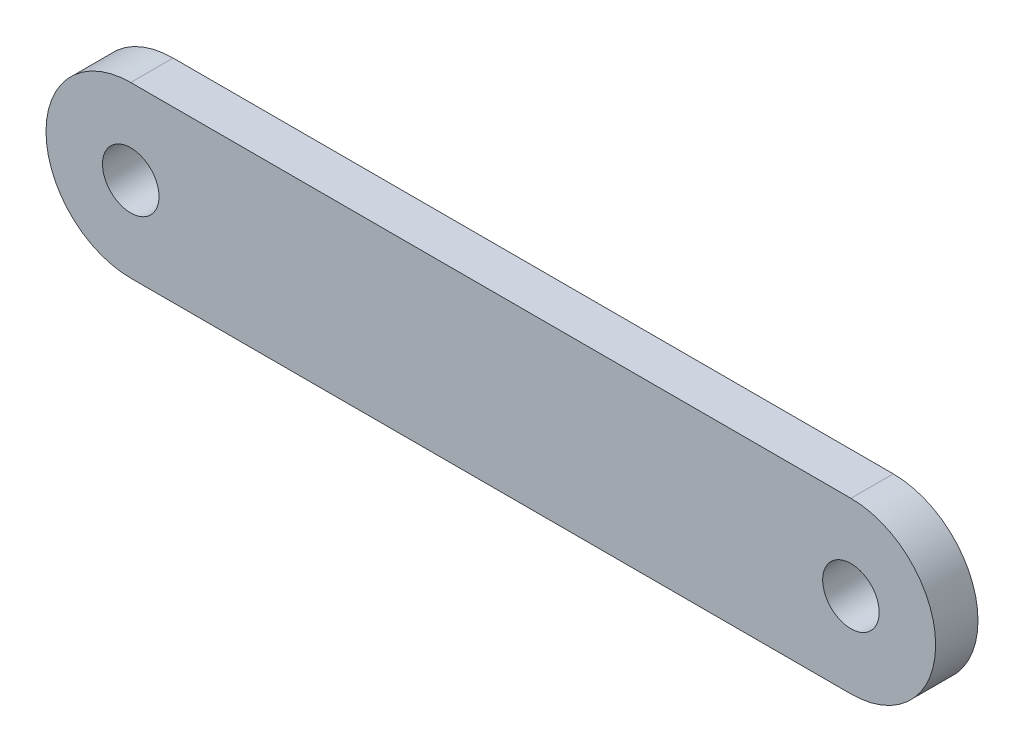
ISO-10303-21;
HEADER;
FILE_DESCRIPTION(('STEP AP214'),'2;1');
FILE_NAME('part.step','',(''),(''),'','','');
FILE_SCHEMA(('AUTOMOTIVE_DESIGN { 1 0 10303 214 1 1 1 1 }'));
ENDSEC;
DATA;
#1=APPLICATION_CONTEXT('core data for automotive mechanical design processes');
#2=APPLICATION_PROTOCOL_DEFINITION('international standard','automotive_design',2000,#1);
#3=PRODUCT_CONTEXT('',#1,'mechanical');
#4=PRODUCT('Part','Part','',(#3));
#5=PRODUCT_RELATED_PRODUCT_CATEGORY('part','',(#4));
#6=PRODUCT_DEFINITION_FORMATION('','',#4);
#7=PRODUCT_DEFINITION_CONTEXT('part definition',#1,'design');
#8=PRODUCT_DEFINITION('design','',#6,#7);
#9=PRODUCT_DEFINITION_SHAPE('','',#8);
#10=(LENGTH_UNIT() NAMED_UNIT(*) SI_UNIT(.MILLI.,.METRE.));
#11=(NAMED_UNIT(*) PLANE_ANGLE_UNIT() SI_UNIT($,.RADIAN.));
#12=(NAMED_UNIT(*) SI_UNIT($,.STERADIAN.) SOLID_ANGLE_UNIT());
#13=UNCERTAINTY_MEASURE_WITH_UNIT(LENGTH_MEASURE(1.E-05),#10,'distance_accuracy_value','');
#14=(GEOMETRIC_REPRESENTATION_CONTEXT(3) GLOBAL_UNCERTAINTY_ASSIGNED_CONTEXT((#13)) GLOBAL_UNIT_ASSIGNED_CONTEXT((#10,
#11,#12)) REPRESENTATION_CONTEXT('',''));
#15=CARTESIAN_POINT('',(0.,0.,0.));
#16=DIRECTION('',(0.,0.,1.));
#17=DIRECTION('',(1.,0.,0.));
#18=AXIS2_PLACEMENT_3D('',#15,#16,#17);
#19=CARTESIAN_POINT('',(-25.5,0.,-1.5));
#20=DIRECTION('',(0.,0.,1.));
#21=DIRECTION('',(1.,0.,0.));
#22=AXIS2_PLACEMENT_3D('',#19,#20,#21);
#23=CYLINDRICAL_SURFACE('',#22,3.);
#24=CARTESIAN_POINT('',(-25.5,0.,0.));
#25=DIRECTION('',(0.,0.,1.));
#26=DIRECTION('',(-1.,0.,0.));
#27=AXIS2_PLACEMENT_3D('',#24,#25,#26);
#28=CIRCLE('',#27,3.);
#29=CARTESIAN_POINT('',(-25.5,3.,0.));
#30=VERTEX_POINT('',#29);
#31=CARTESIAN_POINT('',(-25.5,-3.,0.));
#32=VERTEX_POINT('',#31);
#33=EDGE_CURVE('E95',#30,#32,#28,.T.);
#34=ORIENTED_EDGE('',*,*,#33,.F.);
#35=DIRECTION('',(0.,0.,1.));
#36=VECTOR('',#35,1.);
#37=CARTESIAN_POINT('',(-25.5,3.,-1.5));
#38=LINE('',#37,#36);
#39=CARTESIAN_POINT('',(-25.5,3.,-1.5));
#40=VERTEX_POINT('',#39);
#41=EDGE_CURVE('E11',#40,#30,#38,.T.);
#42=ORIENTED_EDGE('',*,*,#41,.F.);
#43=CARTESIAN_POINT('',(-25.5,0.,-1.5));
#44=DIRECTION('',(0.,0.,1.));
#45=DIRECTION('',(-1.,0.,0.));
#46=AXIS2_PLACEMENT_3D('',#43,#44,#45);
#47=CIRCLE('',#46,3.);
#48=CARTESIAN_POINT('',(-25.5,-3.,-1.5));
#49=VERTEX_POINT('',#48);
#50=EDGE_CURVE('E88',#40,#49,#47,.T.);
#51=ORIENTED_EDGE('',*,*,#50,.T.);
#52=DIRECTION('',(0.,0.,1.));
#53=VECTOR('',#52,1.);
#54=CARTESIAN_POINT('',(-25.5,-3.,-1.5));
#55=LINE('',#54,#53);
#56=EDGE_CURVE('E33',#49,#32,#55,.T.);
#57=ORIENTED_EDGE('',*,*,#56,.T.);
#58=EDGE_LOOP('',(#34,#42,#51,#57));
#59=FACE_BOUND('',#58,.T.);
#60=ADVANCED_FACE('F30',(#59),#23,.T.);
#61=CARTESIAN_POINT('',(-25.5,3.,-1.5));
#62=DIRECTION('',(0.,1.,0.));
#63=DIRECTION('',(0.,0.,1.));
#64=AXIS2_PLACEMENT_3D('',#61,#62,#63);
#65=PLANE('',#64);
#66=DIRECTION('',(-1.,0.,0.));
#67=VECTOR('',#66,1.);
#68=CARTESIAN_POINT('',(-25.5,3.,0.));
#69=LINE('',#68,#67);
#70=CARTESIAN_POINT('',(0.,3.,0.));
#71=VERTEX_POINT('',#70);
#72=EDGE_CURVE('E90',#71,#30,#69,.T.);
#73=ORIENTED_EDGE('',*,*,#72,.F.);
#74=DIRECTION('',(0.,0.,1.));
#75=VECTOR('',#74,1.);
#76=CARTESIAN_POINT('',(0.,3.,-1.5));
#77=LINE('',#76,#75);
#78=CARTESIAN_POINT('',(0.,3.,-1.5));
#79=VERTEX_POINT('',#78);
#80=EDGE_CURVE('E39',#79,#71,#77,.T.);
#81=ORIENTED_EDGE('',*,*,#80,.F.);
#82=DIRECTION('',(-1.,0.,0.));
#83=VECTOR('',#82,1.);
#84=CARTESIAN_POINT('',(-25.5,3.,-1.5));
#85=LINE('',#84,#83);
#86=EDGE_CURVE('E85',#79,#40,#85,.T.);
#87=ORIENTED_EDGE('',*,*,#86,.T.);
#88=ORIENTED_EDGE('',*,*,#41,.T.);
#89=EDGE_LOOP('',(#73,#81,#87,#88));
#90=FACE_BOUND('',#89,.T.);
#91=ADVANCED_FACE('F106',(#90),#65,.T.);
#92=CARTESIAN_POINT('',(0.,0.,-1.5));
#93=DIRECTION('',(0.,0.,1.));
#94=DIRECTION('',(1.,0.,0.));
#95=AXIS2_PLACEMENT_3D('',#92,#93,#94);
#96=CYLINDRICAL_SURFACE('',#95,3.);
#97=CARTESIAN_POINT('',(0.,0.,0.));
#98=DIRECTION('',(0.,0.,1.));
#99=DIRECTION('',(-1.,0.,0.));
#100=AXIS2_PLACEMENT_3D('',#97,#98,#99);
#101=CIRCLE('',#100,3.);
#102=CARTESIAN_POINT('',(0.,-3.,0.));
#103=VERTEX_POINT('',#102);
#104=EDGE_CURVE('E80',#103,#71,#101,.T.);
#105=ORIENTED_EDGE('',*,*,#104,.F.);
#106=DIRECTION('',(0.,0.,1.));
#107=VECTOR('',#106,1.);
#108=CARTESIAN_POINT('',(0.,-3.,-1.5));
#109=LINE('',#108,#107);
#110=CARTESIAN_POINT('',(0.,-3.,-1.5));
#111=VERTEX_POINT('',#110);
#112=EDGE_CURVE('E75',#111,#103,#109,.T.);
#113=ORIENTED_EDGE('',*,*,#112,.F.);
#114=CARTESIAN_POINT('',(0.,0.,-1.5));
#115=DIRECTION('',(0.,0.,1.));
#116=DIRECTION('',(-1.,0.,0.));
#117=AXIS2_PLACEMENT_3D('',#114,#115,#116);
#118=CIRCLE('',#117,3.);
#119=EDGE_CURVE('E78',#111,#79,#118,.T.);
#120=ORIENTED_EDGE('',*,*,#119,.T.);
#121=ORIENTED_EDGE('',*,*,#80,.T.);
#122=EDGE_LOOP('',(#105,#113,#120,#121));
#123=FACE_BOUND('',#122,.T.);
#124=ADVANCED_FACE('F77',(#123),#96,.T.);
#125=CARTESIAN_POINT('',(0.,-3.,-1.5));
#126=DIRECTION('',(0.,-1.,0.));
#127=DIRECTION('',(1.,0.,0.));
#128=AXIS2_PLACEMENT_3D('',#125,#126,#127);
#129=PLANE('',#128);
#130=DIRECTION('',(1.,0.,0.));
#131=VECTOR('',#130,1.);
#132=CARTESIAN_POINT('',(0.,-3.,0.));
#133=LINE('',#132,#131);
#134=EDGE_CURVE('E98',#32,#103,#133,.T.);
#135=ORIENTED_EDGE('',*,*,#134,.F.);
#136=ORIENTED_EDGE('',*,*,#56,.F.);
#137=DIRECTION('',(1.,0.,0.));
#138=VECTOR('',#137,1.);
#139=CARTESIAN_POINT('',(0.,-3.,-1.5));
#140=LINE('',#139,#138);
#141=EDGE_CURVE('E84',#49,#111,#140,.T.);
#142=ORIENTED_EDGE('',*,*,#141,.T.);
#143=ORIENTED_EDGE('',*,*,#112,.T.);
#144=EDGE_LOOP('',(#135,#136,#142,#143));
#145=FACE_BOUND('',#144,.T.);
#146=ADVANCED_FACE('F87',(#145),#129,.T.);
#147=CARTESIAN_POINT('',(-25.5,0.,-1.5));
#148=DIRECTION('',(0.,0.,-1.));
#149=DIRECTION('',(-1.,0.,0.));
#150=AXIS2_PLACEMENT_3D('',#147,#148,#149);
#151=PLANE('',#150);
#152=CARTESIAN_POINT('',(-25.5,0.,-1.5));
#153=DIRECTION('',(0.,0.,1.));
#154=DIRECTION('',(1.,0.,0.));
#155=AXIS2_PLACEMENT_3D('',#152,#153,#154);
#156=CIRCLE('',#155,1.);
#157=CARTESIAN_POINT('',(-24.5,0.,-1.5));
#158=VERTEX_POINT('',#157);
#159=EDGE_CURVE('E139',#158,#158,#156,.T.);
#160=ORIENTED_EDGE('',*,*,#159,.T.);
#161=EDGE_LOOP('',(#160));
#162=FACE_BOUND('',#161,.T.);
#163=CARTESIAN_POINT('',(0.,0.,-1.5));
#164=DIRECTION('',(0.,0.,1.));
#165=DIRECTION('',(1.,0.,0.));
#166=AXIS2_PLACEMENT_3D('',#163,#164,#165);
#167=CIRCLE('',#166,1.);
#168=CARTESIAN_POINT('',(1.,0.,-1.5));
#169=VERTEX_POINT('',#168);
#170=EDGE_CURVE('E99',#169,#169,#167,.T.);
#171=ORIENTED_EDGE('',*,*,#170,.T.);
#172=EDGE_LOOP('',(#171));
#173=FACE_BOUND('',#172,.T.);
#174=ORIENTED_EDGE('',*,*,#50,.F.);
#175=ORIENTED_EDGE('',*,*,#86,.F.);
#176=ORIENTED_EDGE('',*,*,#119,.F.);
#177=ORIENTED_EDGE('',*,*,#141,.F.);
#178=EDGE_LOOP('',(#174,#175,#176,#177));
#179=FACE_BOUND('',#178,.T.);
#180=ADVANCED_FACE('F83',(#162,#173,#179),#151,.T.);
#181=CARTESIAN_POINT('',(-25.5,0.,0.));
#182=DIRECTION('',(0.,0.,-1.));
#183=DIRECTION('',(-1.,0.,0.));
#184=AXIS2_PLACEMENT_3D('',#181,#182,#183);
#185=PLANE('',#184);
#186=CARTESIAN_POINT('',(-25.5,0.,0.));
#187=DIRECTION('',(0.,0.,1.));
#188=DIRECTION('',(1.,0.,0.));
#189=AXIS2_PLACEMENT_3D('',#186,#187,#188);
#190=CIRCLE('',#189,1.);
#191=CARTESIAN_POINT('',(-24.5,0.,0.));
#192=VERTEX_POINT('',#191);
#193=EDGE_CURVE('E142',#192,#192,#190,.T.);
#194=ORIENTED_EDGE('',*,*,#193,.F.);
#195=EDGE_LOOP('',(#194));
#196=FACE_BOUND('',#195,.T.);
#197=CARTESIAN_POINT('',(0.,0.,0.));
#198=DIRECTION('',(0.,0.,1.));
#199=DIRECTION('',(1.,0.,0.));
#200=AXIS2_PLACEMENT_3D('',#197,#198,#199);
#201=CIRCLE('',#200,1.);
#202=CARTESIAN_POINT('',(1.,0.,0.));
#203=VERTEX_POINT('',#202);
#204=EDGE_CURVE('E144',#203,#203,#201,.T.);
#205=ORIENTED_EDGE('',*,*,#204,.F.);
#206=EDGE_LOOP('',(#205));
#207=FACE_BOUND('',#206,.T.);
#208=ORIENTED_EDGE('',*,*,#33,.T.);
#209=ORIENTED_EDGE('',*,*,#134,.T.);
#210=ORIENTED_EDGE('',*,*,#104,.T.);
#211=ORIENTED_EDGE('',*,*,#72,.T.);
#212=EDGE_LOOP('',(#208,#209,#210,#211));
#213=FACE_BOUND('',#212,.T.);
#214=ADVANCED_FACE('F105',(#196,#207,#213),#185,.F.);
#215=CARTESIAN_POINT('',(0.,0.,-1.5));
#216=DIRECTION('',(0.,0.,1.));
#217=DIRECTION('',(1.,0.,0.));
#218=AXIS2_PLACEMENT_3D('',#215,#216,#217);
#219=CYLINDRICAL_SURFACE('',#218,1.);
#220=ORIENTED_EDGE('',*,*,#170,.F.);
#221=EDGE_LOOP('',(#220));
#222=FACE_BOUND('',#221,.T.);
#223=ORIENTED_EDGE('',*,*,#204,.T.);
#224=EDGE_LOOP('',(#223));
#225=FACE_BOUND('',#224,.T.);
#226=ADVANCED_FACE('F124',(#222,#225),#219,.F.);
#227=CARTESIAN_POINT('',(-25.5,0.,-1.5));
#228=DIRECTION('',(0.,0.,1.));
#229=DIRECTION('',(1.,0.,0.));
#230=AXIS2_PLACEMENT_3D('',#227,#228,#229);
#231=CYLINDRICAL_SURFACE('',#230,1.);
#232=ORIENTED_EDGE('',*,*,#159,.F.);
#233=EDGE_LOOP('',(#232));
#234=FACE_BOUND('',#233,.T.);
#235=ORIENTED_EDGE('',*,*,#193,.T.);
#236=EDGE_LOOP('',(#235));
#237=FACE_BOUND('',#236,.T.);
#238=ADVANCED_FACE('F131',(#234,#237),#231,.F.);
#239=CLOSED_SHELL('',(#60,#91,#124,#146,#180,#214,#226,#238));
#240=MANIFOLD_SOLID_BREP('B2',#239);
#241=ADVANCED_BREP_SHAPE_REPRESENTATION('',(#18,#240),#14);
#242=SHAPE_DEFINITION_REPRESENTATION(#9,#241);
ENDSEC;
END-ISO-10303-21;
